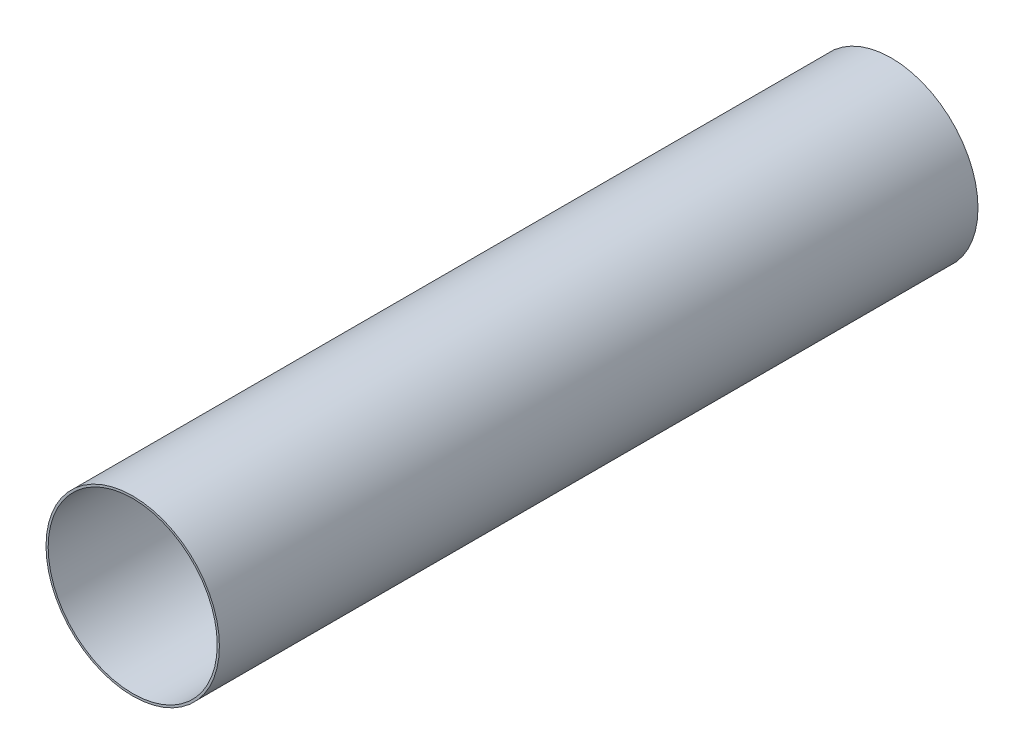
ISO-10303-21;
HEADER;
FILE_DESCRIPTION(('STEP AP214'),'2;1');
FILE_NAME('part.step','',(''),(''),'','','');
FILE_SCHEMA(('AUTOMOTIVE_DESIGN { 1 0 10303 214 1 1 1 1 }'));
ENDSEC;
DATA;
#1=APPLICATION_CONTEXT('core data for automotive mechanical design processes');
#2=APPLICATION_PROTOCOL_DEFINITION('international standard','automotive_design',2000,#1);
#3=PRODUCT_CONTEXT('',#1,'mechanical');
#4=PRODUCT('Part','Part','',(#3));
#5=PRODUCT_RELATED_PRODUCT_CATEGORY('part','',(#4));
#6=PRODUCT_DEFINITION_FORMATION('','',#4);
#7=PRODUCT_DEFINITION_CONTEXT('part definition',#1,'design');
#8=PRODUCT_DEFINITION('design','',#6,#7);
#9=PRODUCT_DEFINITION_SHAPE('','',#8);
#10=(LENGTH_UNIT() NAMED_UNIT(*) SI_UNIT(.MILLI.,.METRE.));
#11=(NAMED_UNIT(*) PLANE_ANGLE_UNIT() SI_UNIT($,.RADIAN.));
#12=(NAMED_UNIT(*) SI_UNIT($,.STERADIAN.) SOLID_ANGLE_UNIT());
#13=UNCERTAINTY_MEASURE_WITH_UNIT(LENGTH_MEASURE(1.E-05),#10,'distance_accuracy_value','');
#14=(GEOMETRIC_REPRESENTATION_CONTEXT(3) GLOBAL_UNCERTAINTY_ASSIGNED_CONTEXT((#13)) GLOBAL_UNIT_ASSIGNED_CONTEXT((#10,
#11,#12)) REPRESENTATION_CONTEXT('',''));
#15=CARTESIAN_POINT('',(0.,0.,0.));
#16=DIRECTION('',(0.,0.,1.));
#17=DIRECTION('',(1.,0.,0.));
#18=AXIS2_PLACEMENT_3D('',#15,#16,#17);
#19=CARTESIAN_POINT('',(0.,0.,700.));
#20=DIRECTION('',(0.,0.,1.));
#21=DIRECTION('',(1.,0.,0.));
#22=AXIS2_PLACEMENT_3D('',#19,#20,#21);
#23=PLANE('',#22);
#24=CARTESIAN_POINT('',(0.,0.,700.));
#25=DIRECTION('',(0.,0.,1.));
#26=DIRECTION('',(1.,0.,0.));
#27=AXIS2_PLACEMENT_3D('',#24,#25,#26);
#28=CIRCLE('',#27,80.);
#29=CARTESIAN_POINT('',(80.,0.,700.));
#30=VERTEX_POINT('',#29);
#31=EDGE_CURVE('E10',#30,#30,#28,.T.);
#32=ORIENTED_EDGE('',*,*,#31,.T.);
#33=EDGE_LOOP('',(#32));
#34=FACE_BOUND('',#33,.T.);
#35=CARTESIAN_POINT('',(0.,0.,700.));
#36=DIRECTION('',(0.,0.,1.));
#37=DIRECTION('',(1.,0.,0.));
#38=AXIS2_PLACEMENT_3D('',#35,#36,#37);
#39=CIRCLE('',#38,78.);
#40=CARTESIAN_POINT('',(78.,0.,700.));
#41=VERTEX_POINT('',#40);
#42=EDGE_CURVE('E41',#41,#41,#39,.T.);
#43=ORIENTED_EDGE('',*,*,#42,.F.);
#44=EDGE_LOOP('',(#43));
#45=FACE_BOUND('',#44,.T.);
#46=ADVANCED_FACE('F30',(#34,#45),#23,.T.);
#47=CARTESIAN_POINT('',(0.,0.,0.));
#48=DIRECTION('',(0.,0.,1.));
#49=DIRECTION('',(1.,0.,0.));
#50=AXIS2_PLACEMENT_3D('',#47,#48,#49);
#51=PLANE('',#50);
#52=CARTESIAN_POINT('',(0.,0.,0.));
#53=DIRECTION('',(0.,0.,1.));
#54=DIRECTION('',(1.,0.,0.));
#55=AXIS2_PLACEMENT_3D('',#52,#53,#54);
#56=CIRCLE('',#55,80.);
#57=CARTESIAN_POINT('',(80.,0.,0.));
#58=VERTEX_POINT('',#57);
#59=EDGE_CURVE('E34',#58,#58,#56,.T.);
#60=ORIENTED_EDGE('',*,*,#59,.F.);
#61=EDGE_LOOP('',(#60));
#62=FACE_BOUND('',#61,.T.);
#63=CARTESIAN_POINT('',(0.,0.,0.));
#64=DIRECTION('',(0.,0.,1.));
#65=DIRECTION('',(1.,0.,0.));
#66=AXIS2_PLACEMENT_3D('',#63,#64,#65);
#67=CIRCLE('',#66,78.);
#68=CARTESIAN_POINT('',(78.,0.,0.));
#69=VERTEX_POINT('',#68);
#70=EDGE_CURVE('E43',#69,#69,#67,.T.);
#71=ORIENTED_EDGE('',*,*,#70,.T.);
#72=EDGE_LOOP('',(#71));
#73=FACE_BOUND('',#72,.T.);
#74=ADVANCED_FACE('F53',(#62,#73),#51,.F.);
#75=CARTESIAN_POINT('',(0.,0.,700.));
#76=DIRECTION('',(0.,0.,-1.));
#77=DIRECTION('',(-1.,0.,0.));
#78=AXIS2_PLACEMENT_3D('',#75,#76,#77);
#79=CYLINDRICAL_SURFACE('',#78,80.);
#80=ORIENTED_EDGE('',*,*,#31,.F.);
#81=EDGE_LOOP('',(#80));
#82=FACE_BOUND('',#81,.T.);
#83=ORIENTED_EDGE('',*,*,#59,.T.);
#84=EDGE_LOOP('',(#83));
#85=FACE_BOUND('',#84,.T.);
#86=ADVANCED_FACE('F32',(#82,#85),#79,.T.);
#87=CARTESIAN_POINT('',(0.,0.,700.));
#88=DIRECTION('',(0.,0.,-1.));
#89=DIRECTION('',(-1.,0.,0.));
#90=AXIS2_PLACEMENT_3D('',#87,#88,#89);
#91=CYLINDRICAL_SURFACE('',#90,78.);
#92=ORIENTED_EDGE('',*,*,#42,.T.);
#93=EDGE_LOOP('',(#92));
#94=FACE_BOUND('',#93,.T.);
#95=ORIENTED_EDGE('',*,*,#70,.F.);
#96=EDGE_LOOP('',(#95));
#97=FACE_BOUND('',#96,.T.);
#98=ADVANCED_FACE('F49',(#94,#97),#91,.F.);
#99=CLOSED_SHELL('',(#46,#74,#86,#98));
#100=MANIFOLD_SOLID_BREP('B2',#99);
#101=ADVANCED_BREP_SHAPE_REPRESENTATION('',(#18,#100),#14);
#102=SHAPE_DEFINITION_REPRESENTATION(#9,#101);
ENDSEC;
END-ISO-10303-21;
